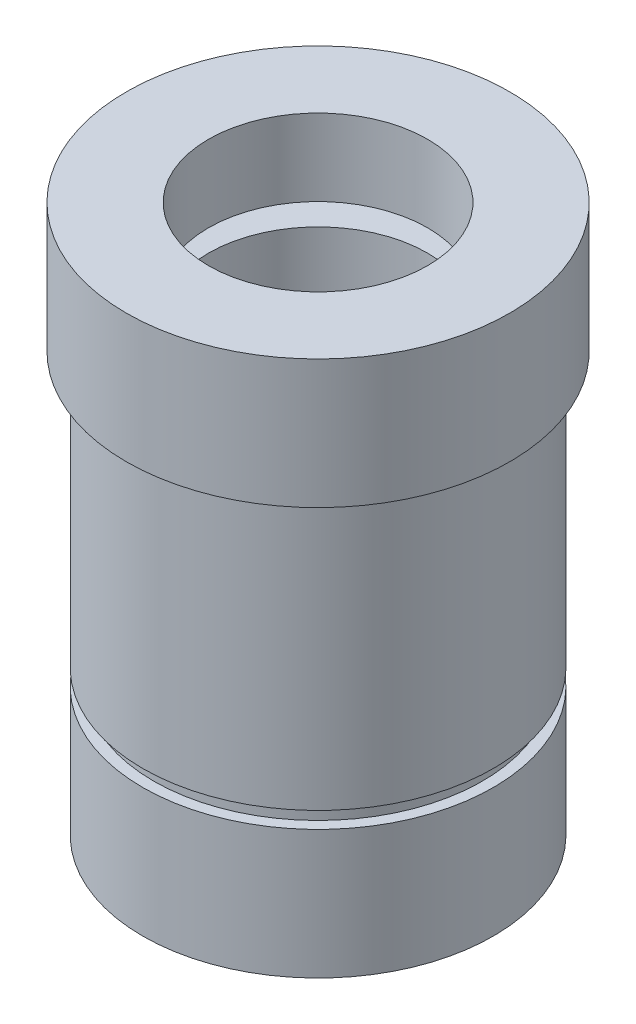
ISO-10303-21;
HEADER;
FILE_DESCRIPTION(('STEP AP214'),'2;1');
FILE_NAME('part.step','',(''),(''),'','','');
FILE_SCHEMA(('AUTOMOTIVE_DESIGN { 1 0 10303 214 1 1 1 1 }'));
ENDSEC;
DATA;
#1=APPLICATION_CONTEXT('core data for automotive mechanical design processes');
#2=APPLICATION_PROTOCOL_DEFINITION('international standard','automotive_design',2000,#1);
#3=PRODUCT_CONTEXT('',#1,'mechanical');
#4=PRODUCT('Part','Part','',(#3));
#5=PRODUCT_RELATED_PRODUCT_CATEGORY('part','',(#4));
#6=PRODUCT_DEFINITION_FORMATION('','',#4);
#7=PRODUCT_DEFINITION_CONTEXT('part definition',#1,'design');
#8=PRODUCT_DEFINITION('design','',#6,#7);
#9=PRODUCT_DEFINITION_SHAPE('','',#8);
#10=(LENGTH_UNIT() NAMED_UNIT(*) SI_UNIT(.MILLI.,.METRE.));
#11=(NAMED_UNIT(*) PLANE_ANGLE_UNIT() SI_UNIT($,.RADIAN.));
#12=(NAMED_UNIT(*) SI_UNIT($,.STERADIAN.) SOLID_ANGLE_UNIT());
#13=UNCERTAINTY_MEASURE_WITH_UNIT(LENGTH_MEASURE(1.E-05),#10,'distance_accuracy_value','');
#14=(GEOMETRIC_REPRESENTATION_CONTEXT(3) GLOBAL_UNCERTAINTY_ASSIGNED_CONTEXT((#13)) GLOBAL_UNIT_ASSIGNED_CONTEXT((#10,
#11,#12)) REPRESENTATION_CONTEXT('',''));
#15=CARTESIAN_POINT('',(0.,0.,0.));
#16=DIRECTION('',(0.,0.,1.));
#17=DIRECTION('',(1.,0.,0.));
#18=AXIS2_PLACEMENT_3D('',#15,#16,#17);
#19=CARTESIAN_POINT('',(0.,-26.8678822354766,0.));
#20=DIRECTION('',(0.,1.,0.));
#21=DIRECTION('',(0.,0.,1.));
#22=AXIS2_PLACEMENT_3D('',#19,#20,#21);
#23=CYLINDRICAL_SURFACE('',#22,10.);
#24=CARTESIAN_POINT('',(0.,14.1321177645234,0.));
#25=DIRECTION('',(0.,1.,0.));
#26=DIRECTION('',(0.,0.,1.));
#27=AXIS2_PLACEMENT_3D('',#24,#25,#26);
#28=CIRCLE('',#27,10.);
#29=CARTESIAN_POINT('',(0.,14.1321177645234,10.));
#30=VERTEX_POINT('',#29);
#31=EDGE_CURVE('E60',#30,#30,#28,.F.);
#32=CARTESIAN_POINT('',(0.,-17.8678822354766,0.));
#33=DIRECTION('',(0.,-1.,0.));
#34=DIRECTION('',(0.,0.,-1.));
#35=AXIS2_PLACEMENT_3D('',#32,#33,#34);
#36=CIRCLE('',#35,10.);
#37=CARTESIAN_POINT('',(0.,-17.8678822354766,10.));
#38=VERTEX_POINT('',#37);
#39=EDGE_CURVE('E41',#38,#38,#36,.F.);
#40=CARTESIAN_POINT('',(0.,14.1321177645234,10.));
#41=CARTESIAN_POINT('',(0.,13.7987844311901,10.));
#42=CARTESIAN_POINT('',(0.,13.4654510978568,10.));
#43=CARTESIAN_POINT('',(0.,12.7987844311901,10.));
#44=CARTESIAN_POINT('',(0.,12.4654510978568,10.));
#45=CARTESIAN_POINT('',(0.,11.7987844311901,10.));
#46=CARTESIAN_POINT('',(0.,11.4654510978568,10.));
#47=CARTESIAN_POINT('',(0.,10.7987844311901,10.));
#48=CARTESIAN_POINT('',(0.,10.4654510978568,10.));
#49=CARTESIAN_POINT('',(0.,9.7987844311901,10.));
#50=CARTESIAN_POINT('',(0.,9.46545109785677,10.));
#51=CARTESIAN_POINT('',(0.,8.7987844311901,10.));
#52=CARTESIAN_POINT('',(0.,8.46545109785676,10.));
#53=CARTESIAN_POINT('',(0.,7.7987844311901,10.));
#54=CARTESIAN_POINT('',(0.,7.46545109785677,10.));
#55=CARTESIAN_POINT('',(0.,6.7987844311901,10.));
#56=CARTESIAN_POINT('',(0.,6.46545109785677,10.));
#57=CARTESIAN_POINT('',(0.,5.7987844311901,10.));
#58=CARTESIAN_POINT('',(0.,5.46545109785677,10.));
#59=CARTESIAN_POINT('',(0.,4.7987844311901,10.));
#60=CARTESIAN_POINT('',(0.,4.46545109785677,10.));
#61=CARTESIAN_POINT('',(0.,3.79878443119011,10.));
#62=CARTESIAN_POINT('',(0.,3.46545109785677,10.));
#63=CARTESIAN_POINT('',(0.,2.7987844311901,10.));
#64=CARTESIAN_POINT('',(0.,2.46545109785677,10.));
#65=CARTESIAN_POINT('',(0.,1.7987844311901,10.));
#66=CARTESIAN_POINT('',(0.,1.46545109785677,10.));
#67=CARTESIAN_POINT('',(0.,0.798784431190106,10.));
#68=CARTESIAN_POINT('',(0.,0.465451097856772,10.));
#69=CARTESIAN_POINT('',(0.,-0.201215568809894,10.));
#70=CARTESIAN_POINT('',(0.,-0.534548902143226,10.));
#71=CARTESIAN_POINT('',(0.,-1.20121556880989,10.));
#72=CARTESIAN_POINT('',(0.,-1.53454890214323,10.));
#73=CARTESIAN_POINT('',(0.,-2.20121556880989,10.));
#74=CARTESIAN_POINT('',(0.,-2.53454890214323,10.));
#75=CARTESIAN_POINT('',(0.,-3.20121556880989,10.));
#76=CARTESIAN_POINT('',(0.,-3.53454890214323,10.));
#77=CARTESIAN_POINT('',(0.,-4.20121556880989,10.));
#78=CARTESIAN_POINT('',(0.,-4.53454890214323,10.));
#79=CARTESIAN_POINT('',(0.,-5.20121556880989,10.));
#80=CARTESIAN_POINT('',(0.,-5.53454890214322,10.));
#81=CARTESIAN_POINT('',(0.,-6.20121556880989,10.));
#82=CARTESIAN_POINT('',(0.,-6.53454890214322,10.));
#83=CARTESIAN_POINT('',(0.,-7.20121556880989,10.));
#84=CARTESIAN_POINT('',(0.,-7.53454890214322,10.));
#85=CARTESIAN_POINT('',(0.,-8.20121556880989,10.));
#86=CARTESIAN_POINT('',(0.,-8.53454890214322,10.));
#87=CARTESIAN_POINT('',(0.,-9.20121556880989,10.));
#88=CARTESIAN_POINT('',(0.,-9.53454890214322,10.));
#89=CARTESIAN_POINT('',(0.,-10.2012155688099,10.));
#90=CARTESIAN_POINT('',(0.,-10.5345489021432,10.));
#91=CARTESIAN_POINT('',(0.,-11.2012155688099,10.));
#92=CARTESIAN_POINT('',(0.,-11.5345489021432,10.));
#93=CARTESIAN_POINT('',(0.,-12.2012155688099,10.));
#94=CARTESIAN_POINT('',(0.,-12.5345489021432,10.));
#95=CARTESIAN_POINT('',(0.,-13.2012155688099,10.));
#96=CARTESIAN_POINT('',(0.,-13.5345489021432,10.));
#97=CARTESIAN_POINT('',(0.,-14.2012155688099,10.));
#98=CARTESIAN_POINT('',(0.,-14.5345489021432,10.));
#99=CARTESIAN_POINT('',(0.,-15.2012155688099,10.));
#100=CARTESIAN_POINT('',(0.,-15.5345489021432,10.));
#101=CARTESIAN_POINT('',(0.,-16.2012155688099,10.));
#102=CARTESIAN_POINT('',(0.,-16.5345489021432,10.));
#103=CARTESIAN_POINT('',(0.,-17.2012155688099,10.));
#104=CARTESIAN_POINT('',(0.,-17.5345489021432,10.));
#105=CARTESIAN_POINT('',(0.,-17.8678822354766,10.));
#106=B_SPLINE_CURVE_WITH_KNOTS('',3,(#40,#41,#42,#43,#44,#45,#46,#47,#48,#49,#50,#51,#52,#53,
#54,#55,#56,#57,#58,#59,#60,#61,#62,#63,#64,#65,#66,#67,#68,#69,#70,#71,#72,#73,#74,#75,#76,#77,
#78,#79,#80,#81,#82,#83,#84,#85,#86,#87,#88,#89,#90,#91,#92,#93,#94,#95,#96,#97,#98,#99,#100,
#101,#102,#103,#104,#105),.UNSPECIFIED.,.F.,.F.,(4,2,2,2,2,2,2,2,2,2,2,2,2,2,2,2,2,2,2,2,2,2,2,
2,2,2,2,2,2,2,2,2,4),(0.,1.,2.,3.,4.,5.,6.,7.,7.99999999999999,8.99999999999999,
9.99999999999999,11.,12.,13.,14.,15.,16.,17.,18.,19.,20.,21.,22.,23.,24.,25.,26.,27.,28.,29.,
30.,31.,32.),.UNSPECIFIED.);
#107=EDGE_CURVE('BSEAM37',#30,#38,#106,.T.);
#108=ORIENTED_EDGE('',*,*,#31,.F.);
#109=ORIENTED_EDGE('',*,*,#39,.F.);
#110=ORIENTED_EDGE('',*,*,#107,.T.);
#111=ORIENTED_EDGE('',*,*,#107,.F.);
#112=EDGE_LOOP('',(#108,#110,#109,#111));
#113=FACE_BOUND('',#112,.T.);
#114=ADVANCED_FACE('F37',(#113),#23,.F.);
#115=CARTESIAN_POINT('',(0.,-19.8678822354766,0.));
#116=DIRECTION('',(0.,-1.,0.));
#117=DIRECTION('',(0.,0.,-1.));
#118=AXIS2_PLACEMENT_3D('',#115,#116,#117);
#119=CIRCLE('',#118,10.);
#120=CARTESIAN_POINT('',(0.,-19.8678822354766,10.));
#121=VERTEX_POINT('',#120);
#122=EDGE_CURVE('E65',#121,#121,#119,.F.);
#123=CARTESIAN_POINT('',(0.,-26.8678822354766,0.));
#124=DIRECTION('',(0.,1.,0.));
#125=DIRECTION('',(0.,0.,1.));
#126=AXIS2_PLACEMENT_3D('',#123,#124,#125);
#127=CIRCLE('',#126,10.);
#128=CARTESIAN_POINT('',(0.,-26.8678822354766,10.));
#129=VERTEX_POINT('',#128);
#130=EDGE_CURVE('E90',#129,#129,#127,.T.);
#131=CARTESIAN_POINT('',(0.,-19.8678822354766,10.));
#132=CARTESIAN_POINT('',(0.,-19.9407989021432,10.));
#133=CARTESIAN_POINT('',(0.,-20.0137155688099,10.));
#134=CARTESIAN_POINT('',(0.,-20.1595489021432,10.));
#135=CARTESIAN_POINT('',(0.,-20.2324655688099,10.));
#136=CARTESIAN_POINT('',(0.,-20.3782989021432,10.));
#137=CARTESIAN_POINT('',(0.,-20.4512155688099,10.));
#138=CARTESIAN_POINT('',(0.,-20.5970489021432,10.));
#139=CARTESIAN_POINT('',(0.,-20.6699655688099,10.));
#140=CARTESIAN_POINT('',(0.,-20.8157989021432,10.));
#141=CARTESIAN_POINT('',(0.,-20.8887155688099,10.));
#142=CARTESIAN_POINT('',(0.,-21.0345489021432,10.));
#143=CARTESIAN_POINT('',(0.,-21.1074655688099,10.));
#144=CARTESIAN_POINT('',(0.,-21.2532989021432,10.));
#145=CARTESIAN_POINT('',(0.,-21.3262155688099,10.));
#146=CARTESIAN_POINT('',(0.,-21.4720489021432,10.));
#147=CARTESIAN_POINT('',(0.,-21.5449655688099,10.));
#148=CARTESIAN_POINT('',(0.,-21.6907989021432,10.));
#149=CARTESIAN_POINT('',(0.,-21.7637155688099,10.));
#150=CARTESIAN_POINT('',(0.,-21.9095489021432,10.));
#151=CARTESIAN_POINT('',(0.,-21.9824655688099,10.));
#152=CARTESIAN_POINT('',(0.,-22.1282989021432,10.));
#153=CARTESIAN_POINT('',(0.,-22.2012155688099,10.));
#154=CARTESIAN_POINT('',(0.,-22.3470489021432,10.));
#155=CARTESIAN_POINT('',(0.,-22.4199655688099,10.));
#156=CARTESIAN_POINT('',(0.,-22.5657989021432,10.));
#157=CARTESIAN_POINT('',(0.,-22.6387155688099,10.));
#158=CARTESIAN_POINT('',(0.,-22.7845489021432,10.));
#159=CARTESIAN_POINT('',(0.,-22.8574655688099,10.));
#160=CARTESIAN_POINT('',(0.,-23.0032989021432,10.));
#161=CARTESIAN_POINT('',(0.,-23.0762155688099,10.));
#162=CARTESIAN_POINT('',(0.,-23.2220489021432,10.));
#163=CARTESIAN_POINT('',(0.,-23.2949655688099,10.));
#164=CARTESIAN_POINT('',(0.,-23.4407989021432,10.));
#165=CARTESIAN_POINT('',(0.,-23.5137155688099,10.));
#166=CARTESIAN_POINT('',(0.,-23.6595489021432,10.));
#167=CARTESIAN_POINT('',(0.,-23.7324655688099,10.));
#168=CARTESIAN_POINT('',(0.,-23.8782989021432,10.));
#169=CARTESIAN_POINT('',(0.,-23.9512155688099,10.));
#170=CARTESIAN_POINT('',(0.,-24.0970489021432,10.));
#171=CARTESIAN_POINT('',(0.,-24.1699655688099,10.));
#172=CARTESIAN_POINT('',(0.,-24.3157989021432,10.));
#173=CARTESIAN_POINT('',(0.,-24.3887155688099,10.));
#174=CARTESIAN_POINT('',(0.,-24.5345489021432,10.));
#175=CARTESIAN_POINT('',(0.,-24.6074655688099,10.));
#176=CARTESIAN_POINT('',(0.,-24.7532989021432,10.));
#177=CARTESIAN_POINT('',(0.,-24.8262155688099,10.));
#178=CARTESIAN_POINT('',(0.,-24.9720489021432,10.));
#179=CARTESIAN_POINT('',(0.,-25.0449655688099,10.));
#180=CARTESIAN_POINT('',(0.,-25.1907989021432,10.));
#181=CARTESIAN_POINT('',(0.,-25.2637155688099,10.));
#182=CARTESIAN_POINT('',(0.,-25.4095489021432,10.));
#183=CARTESIAN_POINT('',(0.,-25.4824655688099,10.));
#184=CARTESIAN_POINT('',(0.,-25.6282989021432,10.));
#185=CARTESIAN_POINT('',(0.,-25.7012155688099,10.));
#186=CARTESIAN_POINT('',(0.,-25.8470489021432,10.));
#187=CARTESIAN_POINT('',(0.,-25.9199655688099,10.));
#188=CARTESIAN_POINT('',(0.,-26.0657989021432,10.));
#189=CARTESIAN_POINT('',(0.,-26.1387155688099,10.));
#190=CARTESIAN_POINT('',(0.,-26.2845489021432,10.));
#191=CARTESIAN_POINT('',(0.,-26.3574655688099,10.));
#192=CARTESIAN_POINT('',(0.,-26.5032989021432,10.));
#193=CARTESIAN_POINT('',(0.,-26.5762155688099,10.));
#194=CARTESIAN_POINT('',(0.,-26.7220489021432,10.));
#195=CARTESIAN_POINT('',(0.,-26.7949655688099,10.));
#196=CARTESIAN_POINT('',(0.,-26.8678822354766,10.));
#197=B_SPLINE_CURVE_WITH_KNOTS('',3,(#131,#132,#133,#134,#135,#136,#137,#138,#139,#140,#141,
#142,#143,#144,#145,#146,#147,#148,#149,#150,#151,#152,#153,#154,#155,#156,#157,#158,#159,#160,
#161,#162,#163,#164,#165,#166,#167,#168,#169,#170,#171,#172,#173,#174,#175,#176,#177,#178,#179,
#180,#181,#182,#183,#184,#185,#186,#187,#188,#189,#190,#191,#192,#193,#194,#195,#196),
.UNSPECIFIED.,.F.,.F.,(4,2,2,2,2,2,2,2,2,2,2,2,2,2,2,2,2,2,2,2,2,2,2,2,2,2,2,2,2,2,2,2,4),(0.,
0.21875,0.4375,0.656250000000001,0.875000000000001,1.09375,1.3125,1.53125,1.75,1.96875,2.1875,
2.40625,2.625,2.84375,3.0625,3.28125,3.5,3.71875,3.9375,4.15625,4.375,4.59375,4.8125,5.03125,
5.25,5.46875,5.68750000000001,5.90625000000001,6.12500000000001,6.34375000000001,
6.56250000000001,6.78125000000001,7.),.UNSPECIFIED.);
#198=EDGE_CURVE('BSEAM163',#121,#129,#197,.T.);
#199=ORIENTED_EDGE('',*,*,#122,.T.);
#200=ORIENTED_EDGE('',*,*,#130,.F.);
#201=ORIENTED_EDGE('',*,*,#198,.T.);
#202=ORIENTED_EDGE('',*,*,#198,.F.);
#203=EDGE_LOOP('',(#199,#201,#200,#202));
#204=FACE_BOUND('',#203,.T.);
#205=ADVANCED_FACE('F163',(#204),#23,.F.);
#206=CARTESIAN_POINT('',(0.,23.1321177645234,0.));
#207=DIRECTION('',(0.,-1.,0.));
#208=DIRECTION('',(0.,0.,-1.));
#209=AXIS2_PLACEMENT_3D('',#206,#207,#208);
#210=PLANE('',#209);
#211=CARTESIAN_POINT('',(0.,23.1321177645234,0.));
#212=DIRECTION('',(0.,1.,0.));
#213=DIRECTION('',(0.,0.,1.));
#214=AXIS2_PLACEMENT_3D('',#211,#212,#213);
#215=CIRCLE('',#214,10.);
#216=CARTESIAN_POINT('',(0.,23.1321177645234,10.));
#217=VERTEX_POINT('',#216);
#218=EDGE_CURVE('E64',#217,#217,#215,.T.);
#219=ORIENTED_EDGE('',*,*,#218,.F.);
#220=EDGE_LOOP('',(#219));
#221=FACE_BOUND('',#220,.T.);
#222=CARTESIAN_POINT('',(0.,23.1321177645234,0.));
#223=DIRECTION('',(0.,1.,0.));
#224=DIRECTION('',(0.,0.,1.));
#225=AXIS2_PLACEMENT_3D('',#222,#223,#224);
#226=CIRCLE('',#225,17.5);
#227=CARTESIAN_POINT('',(0.,23.1321177645234,17.5));
#228=VERTEX_POINT('',#227);
#229=EDGE_CURVE('E10',#228,#228,#226,.T.);
#230=ORIENTED_EDGE('',*,*,#229,.T.);
#231=EDGE_LOOP('',(#230));
#232=FACE_BOUND('',#231,.T.);
#233=ADVANCED_FACE('F39',(#221,#232),#210,.F.);
#234=CARTESIAN_POINT('',(0.,23.3627204030227,0.));
#235=DIRECTION('',(0.,1.,0.));
#236=DIRECTION('',(0.,0.,1.));
#237=AXIS2_PLACEMENT_3D('',#234,#235,#236);
#238=CYLINDRICAL_SURFACE('',#237,17.5);
#239=ORIENTED_EDGE('',*,*,#229,.F.);
#240=EDGE_LOOP('',(#239));
#241=FACE_BOUND('',#240,.T.);
#242=CARTESIAN_POINT('',(0.,11.3821177645234,0.));
#243=DIRECTION('',(0.,1.,0.));
#244=DIRECTION('',(0.,0.,1.));
#245=AXIS2_PLACEMENT_3D('',#242,#243,#244);
#246=CIRCLE('',#245,17.5);
#247=CARTESIAN_POINT('',(0.,11.3821177645234,17.5));
#248=VERTEX_POINT('',#247);
#249=EDGE_CURVE('E46',#248,#248,#246,.T.);
#250=ORIENTED_EDGE('',*,*,#249,.T.);
#251=EDGE_LOOP('',(#250));
#252=FACE_BOUND('',#251,.T.);
#253=ADVANCED_FACE('F279',(#241,#252),#238,.T.);
#254=CARTESIAN_POINT('',(17.5,11.3821177645234,0.));
#255=DIRECTION('',(0.,1.,0.));
#256=DIRECTION('',(0.,0.,1.));
#257=AXIS2_PLACEMENT_3D('',#254,#255,#256);
#258=PLANE('',#257);
#259=ORIENTED_EDGE('',*,*,#249,.F.);
#260=EDGE_LOOP('',(#259));
#261=FACE_BOUND('',#260,.T.);
#262=CARTESIAN_POINT('',(0.,11.3821177645234,0.));
#263=DIRECTION('',(0.,1.,0.));
#264=DIRECTION('',(0.,0.,1.));
#265=AXIS2_PLACEMENT_3D('',#262,#263,#264);
#266=CIRCLE('',#265,16.);
#267=CARTESIAN_POINT('',(0.,11.3821177645234,16.));
#268=VERTEX_POINT('',#267);
#269=EDGE_CURVE('E52',#268,#268,#266,.T.);
#270=ORIENTED_EDGE('',*,*,#269,.T.);
#271=EDGE_LOOP('',(#270));
#272=FACE_BOUND('',#271,.T.);
#273=ADVANCED_FACE('F120',(#261,#272),#258,.F.);
#274=CARTESIAN_POINT('',(0.,23.3627204030227,0.));
#275=DIRECTION('',(0.,1.,0.));
#276=DIRECTION('',(0.,0.,1.));
#277=AXIS2_PLACEMENT_3D('',#274,#275,#276);
#278=CYLINDRICAL_SURFACE('',#277,16.);
#279=ORIENTED_EDGE('',*,*,#269,.F.);
#280=EDGE_LOOP('',(#279));
#281=FACE_BOUND('',#280,.T.);
#282=CARTESIAN_POINT('',(0.,-13.6178822354766,0.));
#283=DIRECTION('',(0.,1.,0.));
#284=DIRECTION('',(0.,0.,1.));
#285=AXIS2_PLACEMENT_3D('',#282,#283,#284);
#286=CIRCLE('',#285,16.);
#287=CARTESIAN_POINT('',(0.,-13.6178822354766,16.));
#288=VERTEX_POINT('',#287);
#289=EDGE_CURVE('E113',#288,#288,#286,.T.);
#290=ORIENTED_EDGE('',*,*,#289,.T.);
#291=EDGE_LOOP('',(#290));
#292=FACE_BOUND('',#291,.T.);
#293=ADVANCED_FACE('F122',(#281,#292),#278,.T.);
#294=CARTESIAN_POINT('',(16.,-13.6178822354766,0.));
#295=DIRECTION('',(0.,1.,0.));
#296=DIRECTION('',(0.,0.,1.));
#297=AXIS2_PLACEMENT_3D('',#294,#295,#296);
#298=PLANE('',#297);
#299=ORIENTED_EDGE('',*,*,#289,.F.);
#300=EDGE_LOOP('',(#299));
#301=FACE_BOUND('',#300,.T.);
#302=CARTESIAN_POINT('',(0.,-13.6178822354766,0.));
#303=DIRECTION('',(0.,1.,0.));
#304=DIRECTION('',(0.,0.,1.));
#305=AXIS2_PLACEMENT_3D('',#302,#303,#304);
#306=CIRCLE('',#305,15.);
#307=CARTESIAN_POINT('',(0.,-13.6178822354766,15.));
#308=VERTEX_POINT('',#307);
#309=EDGE_CURVE('E109',#308,#308,#306,.T.);
#310=ORIENTED_EDGE('',*,*,#309,.T.);
#311=EDGE_LOOP('',(#310));
#312=FACE_BOUND('',#311,.T.);
#313=ADVANCED_FACE('F125',(#301,#312),#298,.F.);
#314=CARTESIAN_POINT('',(0.,23.3627204030227,0.));
#315=DIRECTION('',(0.,1.,0.));
#316=DIRECTION('',(0.,0.,1.));
#317=AXIS2_PLACEMENT_3D('',#314,#315,#316);
#318=CYLINDRICAL_SURFACE('',#317,15.);
#319=ORIENTED_EDGE('',*,*,#309,.F.);
#320=EDGE_LOOP('',(#319));
#321=FACE_BOUND('',#320,.T.);
#322=CARTESIAN_POINT('',(0.,-15.1178822354766,0.));
#323=DIRECTION('',(0.,1.,0.));
#324=DIRECTION('',(0.,0.,1.));
#325=AXIS2_PLACEMENT_3D('',#322,#323,#324);
#326=CIRCLE('',#325,15.);
#327=CARTESIAN_POINT('',(0.,-15.1178822354766,15.));
#328=VERTEX_POINT('',#327);
#329=EDGE_CURVE('E105',#328,#328,#326,.T.);
#330=ORIENTED_EDGE('',*,*,#329,.T.);
#331=EDGE_LOOP('',(#330));
#332=FACE_BOUND('',#331,.T.);
#333=ADVANCED_FACE('F131',(#321,#332),#318,.T.);
#334=CARTESIAN_POINT('',(15.,-15.1178822354766,0.));
#335=DIRECTION('',(0.,-1.,0.));
#336=DIRECTION('',(0.,0.,-1.));
#337=AXIS2_PLACEMENT_3D('',#334,#335,#336);
#338=PLANE('',#337);
#339=ORIENTED_EDGE('',*,*,#329,.F.);
#340=EDGE_LOOP('',(#339));
#341=FACE_BOUND('',#340,.T.);
#342=CARTESIAN_POINT('',(0.,-15.1178822354766,0.));
#343=DIRECTION('',(0.,1.,0.));
#344=DIRECTION('',(0.,0.,1.));
#345=AXIS2_PLACEMENT_3D('',#342,#343,#344);
#346=CIRCLE('',#345,16.);
#347=CARTESIAN_POINT('',(0.,-15.1178822354766,16.));
#348=VERTEX_POINT('',#347);
#349=EDGE_CURVE('E101',#348,#348,#346,.T.);
#350=ORIENTED_EDGE('',*,*,#349,.T.);
#351=EDGE_LOOP('',(#350));
#352=FACE_BOUND('',#351,.T.);
#353=ADVANCED_FACE('F137',(#341,#352),#338,.F.);
#354=CARTESIAN_POINT('',(0.,23.3627204030227,0.));
#355=DIRECTION('',(0.,1.,0.));
#356=DIRECTION('',(0.,0.,1.));
#357=AXIS2_PLACEMENT_3D('',#354,#355,#356);
#358=CYLINDRICAL_SURFACE('',#357,16.);
#359=ORIENTED_EDGE('',*,*,#349,.F.);
#360=EDGE_LOOP('',(#359));
#361=FACE_BOUND('',#360,.T.);
#362=CARTESIAN_POINT('',(0.,-26.8678822354766,0.));
#363=DIRECTION('',(0.,1.,0.));
#364=DIRECTION('',(0.,0.,1.));
#365=AXIS2_PLACEMENT_3D('',#362,#363,#364);
#366=CIRCLE('',#365,16.);
#367=CARTESIAN_POINT('',(0.,-26.8678822354766,16.));
#368=VERTEX_POINT('',#367);
#369=EDGE_CURVE('E94',#368,#368,#366,.T.);
#370=ORIENTED_EDGE('',*,*,#369,.T.);
#371=EDGE_LOOP('',(#370));
#372=FACE_BOUND('',#371,.T.);
#373=ADVANCED_FACE('F143',(#361,#372),#358,.T.);
#374=CARTESIAN_POINT('',(16.,-26.8678822354766,0.));
#375=DIRECTION('',(0.,1.,0.));
#376=DIRECTION('',(0.,0.,1.));
#377=AXIS2_PLACEMENT_3D('',#374,#375,#376);
#378=PLANE('',#377);
#379=ORIENTED_EDGE('',*,*,#130,.T.);
#380=EDGE_LOOP('',(#379));
#381=FACE_BOUND('',#380,.T.);
#382=ORIENTED_EDGE('',*,*,#369,.F.);
#383=EDGE_LOOP('',(#382));
#384=FACE_BOUND('',#383,.T.);
#385=ADVANCED_FACE('F149',(#381,#384),#378,.F.);
#386=CARTESIAN_POINT('',(0.,16.1321177645234,0.));
#387=DIRECTION('',(0.,1.,0.));
#388=DIRECTION('',(0.,0.,1.));
#389=AXIS2_PLACEMENT_3D('',#386,#387,#388);
#390=CIRCLE('',#389,10.);
#391=CARTESIAN_POINT('',(0.,16.1321177645234,10.));
#392=VERTEX_POINT('',#391);
#393=EDGE_CURVE('E56',#392,#392,#390,.F.);
#394=CARTESIAN_POINT('',(0.,16.1321177645234,10.));
#395=CARTESIAN_POINT('',(0.,16.2050344311901,10.));
#396=CARTESIAN_POINT('',(0.,16.2779510978568,10.));
#397=CARTESIAN_POINT('',(0.,16.4237844311901,10.));
#398=CARTESIAN_POINT('',(0.,16.4967010978568,10.));
#399=CARTESIAN_POINT('',(0.,16.6425344311901,10.));
#400=CARTESIAN_POINT('',(0.,16.7154510978568,10.));
#401=CARTESIAN_POINT('',(0.,16.8612844311901,10.));
#402=CARTESIAN_POINT('',(0.,16.9342010978568,10.));
#403=CARTESIAN_POINT('',(0.,17.0800344311901,10.));
#404=CARTESIAN_POINT('',(0.,17.1529510978568,10.));
#405=CARTESIAN_POINT('',(0.,17.2987844311901,10.));
#406=CARTESIAN_POINT('',(0.,17.3717010978568,10.));
#407=CARTESIAN_POINT('',(0.,17.5175344311901,10.));
#408=CARTESIAN_POINT('',(0.,17.5904510978568,10.));
#409=CARTESIAN_POINT('',(0.,17.7362844311901,10.));
#410=CARTESIAN_POINT('',(0.,17.8092010978568,10.));
#411=CARTESIAN_POINT('',(0.,17.9550344311901,10.));
#412=CARTESIAN_POINT('',(0.,18.0279510978568,10.));
#413=CARTESIAN_POINT('',(0.,18.1737844311901,10.));
#414=CARTESIAN_POINT('',(0.,18.2467010978568,10.));
#415=CARTESIAN_POINT('',(0.,18.3925344311901,10.));
#416=CARTESIAN_POINT('',(0.,18.4654510978568,10.));
#417=CARTESIAN_POINT('',(0.,18.6112844311901,10.));
#418=CARTESIAN_POINT('',(0.,18.6842010978568,10.));
#419=CARTESIAN_POINT('',(0.,18.8300344311901,10.));
#420=CARTESIAN_POINT('',(0.,18.9029510978568,10.));
#421=CARTESIAN_POINT('',(0.,19.0487844311901,10.));
#422=CARTESIAN_POINT('',(0.,19.1217010978568,10.));
#423=CARTESIAN_POINT('',(0.,19.2675344311901,10.));
#424=CARTESIAN_POINT('',(0.,19.3404510978568,10.));
#425=CARTESIAN_POINT('',(0.,19.4862844311901,10.));
#426=CARTESIAN_POINT('',(0.,19.5592010978568,10.));
#427=CARTESIAN_POINT('',(0.,19.7050344311901,10.));
#428=CARTESIAN_POINT('',(0.,19.7779510978568,10.));
#429=CARTESIAN_POINT('',(0.,19.9237844311901,10.));
#430=CARTESIAN_POINT('',(0.,19.9967010978568,10.));
#431=CARTESIAN_POINT('',(0.,20.1425344311901,10.));
#432=CARTESIAN_POINT('',(0.,20.2154510978568,10.));
#433=CARTESIAN_POINT('',(0.,20.3612844311901,10.));
#434=CARTESIAN_POINT('',(0.,20.4342010978568,10.));
#435=CARTESIAN_POINT('',(0.,20.5800344311901,10.));
#436=CARTESIAN_POINT('',(0.,20.6529510978568,10.));
#437=CARTESIAN_POINT('',(0.,20.7987844311901,10.));
#438=CARTESIAN_POINT('',(0.,20.8717010978568,10.));
#439=CARTESIAN_POINT('',(0.,21.0175344311901,10.));
#440=CARTESIAN_POINT('',(0.,21.0904510978568,10.));
#441=CARTESIAN_POINT('',(0.,21.2362844311901,10.));
#442=CARTESIAN_POINT('',(0.,21.3092010978568,10.));
#443=CARTESIAN_POINT('',(0.,21.4550344311901,10.));
#444=CARTESIAN_POINT('',(0.,21.5279510978568,10.));
#445=CARTESIAN_POINT('',(0.,21.6737844311901,10.));
#446=CARTESIAN_POINT('',(0.,21.7467010978568,10.));
#447=CARTESIAN_POINT('',(0.,21.8925344311901,10.));
#448=CARTESIAN_POINT('',(0.,21.9654510978568,10.));
#449=CARTESIAN_POINT('',(0.,22.1112844311901,10.));
#450=CARTESIAN_POINT('',(0.,22.1842010978568,10.));
#451=CARTESIAN_POINT('',(0.,22.3300344311901,10.));
#452=CARTESIAN_POINT('',(0.,22.4029510978568,10.));
#453=CARTESIAN_POINT('',(0.,22.5487844311901,10.));
#454=CARTESIAN_POINT('',(0.,22.6217010978568,10.));
#455=CARTESIAN_POINT('',(0.,22.7675344311901,10.));
#456=CARTESIAN_POINT('',(0.,22.8404510978568,10.));
#457=CARTESIAN_POINT('',(0.,22.9862844311901,10.));
#458=CARTESIAN_POINT('',(0.,23.0592010978568,10.));
#459=CARTESIAN_POINT('',(0.,23.1321177645234,10.));
#460=B_SPLINE_CURVE_WITH_KNOTS('',3,(#394,#395,#396,#397,#398,#399,#400,#401,#402,#403,#404,
#405,#406,#407,#408,#409,#410,#411,#412,#413,#414,#415,#416,#417,#418,#419,#420,#421,#422,#423,
#424,#425,#426,#427,#428,#429,#430,#431,#432,#433,#434,#435,#436,#437,#438,#439,#440,#441,#442,
#443,#444,#445,#446,#447,#448,#449,#450,#451,#452,#453,#454,#455,#456,#457,#458,#459),
.UNSPECIFIED.,.F.,.F.,(4,2,2,2,2,2,2,2,2,2,2,2,2,2,2,2,2,2,2,2,2,2,2,2,2,2,2,2,2,2,2,2,4),(0.,
0.218750000000004,0.4375,0.656249999999997,0.875000000000001,1.09375,1.3125,1.53125,1.75,
1.96875000000001,2.1875,2.40625,2.625,2.84375000000001,3.0625,3.28125,3.5,3.71875000000001,
3.9375,4.15625,4.375,4.59375000000001,4.8125,5.03125,5.25,5.46875000000001,5.68750000000001,
5.90625,6.12500000000001,6.34375000000001,6.56250000000001,6.78125,7.00000000000001),.UNSPECIFIED.);
#461=EDGE_CURVE('BSEAM154',#392,#217,#460,.T.);
#462=ORIENTED_EDGE('',*,*,#393,.T.);
#463=ORIENTED_EDGE('',*,*,#218,.T.);
#464=ORIENTED_EDGE('',*,*,#461,.T.);
#465=ORIENTED_EDGE('',*,*,#461,.F.);
#466=EDGE_LOOP('',(#462,#464,#463,#465));
#467=FACE_BOUND('',#466,.T.);
#468=ADVANCED_FACE('F154',(#467),#23,.F.);
#469=CARTESIAN_POINT('',(0.,14.1321177645234,0.));
#470=DIRECTION('',(0.,1.,0.));
#471=DIRECTION('',(0.,0.,1.));
#472=AXIS2_PLACEMENT_3D('',#469,#470,#471);
#473=PLANE('',#472);
#474=CARTESIAN_POINT('',(0.,14.1321177645234,0.));
#475=DIRECTION('',(0.,1.,0.));
#476=DIRECTION('',(0.,0.,1.));
#477=AXIS2_PLACEMENT_3D('',#474,#475,#476);
#478=CIRCLE('',#477,13.);
#479=CARTESIAN_POINT('',(0.,14.1321177645234,13.));
#480=VERTEX_POINT('',#479);
#481=EDGE_CURVE('E61',#480,#480,#478,.T.);
#482=ORIENTED_EDGE('',*,*,#481,.T.);
#483=EDGE_LOOP('',(#482));
#484=FACE_BOUND('',#483,.T.);
#485=ORIENTED_EDGE('',*,*,#31,.T.);
#486=EDGE_LOOP('',(#485));
#487=FACE_BOUND('',#486,.T.);
#488=ADVANCED_FACE('F160',(#484,#487),#473,.T.);
#489=CARTESIAN_POINT('',(0.,16.1321177645234,0.));
#490=DIRECTION('',(0.,1.,0.));
#491=DIRECTION('',(0.,0.,1.));
#492=AXIS2_PLACEMENT_3D('',#489,#490,#491);
#493=PLANE('',#492);
#494=CARTESIAN_POINT('',(0.,16.1321177645234,0.));
#495=DIRECTION('',(0.,1.,0.));
#496=DIRECTION('',(0.,0.,1.));
#497=AXIS2_PLACEMENT_3D('',#494,#495,#496);
#498=CIRCLE('',#497,13.);
#499=CARTESIAN_POINT('',(0.,16.1321177645234,13.));
#500=VERTEX_POINT('',#499);
#501=EDGE_CURVE('E74',#500,#500,#498,.T.);
#502=ORIENTED_EDGE('',*,*,#501,.F.);
#503=EDGE_LOOP('',(#502));
#504=FACE_BOUND('',#503,.T.);
#505=ORIENTED_EDGE('',*,*,#393,.F.);
#506=EDGE_LOOP('',(#505));
#507=FACE_BOUND('',#506,.T.);
#508=ADVANCED_FACE('F176',(#504,#507),#493,.F.);
#509=CARTESIAN_POINT('',(0.,14.1321177645234,0.));
#510=DIRECTION('',(0.,1.,0.));
#511=DIRECTION('',(0.,0.,1.));
#512=AXIS2_PLACEMENT_3D('',#509,#510,#511);
#513=CYLINDRICAL_SURFACE('',#512,13.);
#514=ORIENTED_EDGE('',*,*,#481,.F.);
#515=EDGE_LOOP('',(#514));
#516=FACE_BOUND('',#515,.T.);
#517=ORIENTED_EDGE('',*,*,#501,.T.);
#518=EDGE_LOOP('',(#517));
#519=FACE_BOUND('',#518,.T.);
#520=ADVANCED_FACE('F172',(#516,#519),#513,.F.);
#521=CARTESIAN_POINT('',(0.,-17.8678822354766,0.));
#522=DIRECTION('',(0.,-1.,0.));
#523=DIRECTION('',(0.,0.,-1.));
#524=AXIS2_PLACEMENT_3D('',#521,#522,#523);
#525=PLANE('',#524);
#526=CARTESIAN_POINT('',(0.,-17.8678822354766,0.));
#527=DIRECTION('',(0.,-1.,0.));
#528=DIRECTION('',(0.,0.,-1.));
#529=AXIS2_PLACEMENT_3D('',#526,#527,#528);
#530=CIRCLE('',#529,13.);
#531=CARTESIAN_POINT('',(0.,-17.8678822354766,-13.));
#532=VERTEX_POINT('',#531);
#533=EDGE_CURVE('E68',#532,#532,#530,.T.);
#534=ORIENTED_EDGE('',*,*,#533,.T.);
#535=EDGE_LOOP('',(#534));
#536=FACE_BOUND('',#535,.T.);
#537=ORIENTED_EDGE('',*,*,#39,.T.);
#538=EDGE_LOOP('',(#537));
#539=FACE_BOUND('',#538,.T.);
#540=ADVANCED_FACE('F175',(#536,#539),#525,.T.);
#541=CARTESIAN_POINT('',(0.,-19.8678822354766,0.));
#542=DIRECTION('',(0.,-1.,0.));
#543=DIRECTION('',(0.,0.,-1.));
#544=AXIS2_PLACEMENT_3D('',#541,#542,#543);
#545=PLANE('',#544);
#546=CARTESIAN_POINT('',(0.,-19.8678822354766,0.));
#547=DIRECTION('',(0.,-1.,0.));
#548=DIRECTION('',(0.,0.,-1.));
#549=AXIS2_PLACEMENT_3D('',#546,#547,#548);
#550=CIRCLE('',#549,13.);
#551=CARTESIAN_POINT('',(0.,-19.8678822354766,-13.));
#552=VERTEX_POINT('',#551);
#553=EDGE_CURVE('E76',#552,#552,#550,.T.);
#554=ORIENTED_EDGE('',*,*,#553,.F.);
#555=EDGE_LOOP('',(#554));
#556=FACE_BOUND('',#555,.T.);
#557=ORIENTED_EDGE('',*,*,#122,.F.);
#558=EDGE_LOOP('',(#557));
#559=FACE_BOUND('',#558,.T.);
#560=ADVANCED_FACE('F187',(#556,#559),#545,.F.);
#561=CARTESIAN_POINT('',(0.,-17.8678822354766,0.));
#562=DIRECTION('',(0.,-1.,0.));
#563=DIRECTION('',(0.,0.,-1.));
#564=AXIS2_PLACEMENT_3D('',#561,#562,#563);
#565=CYLINDRICAL_SURFACE('',#564,13.);
#566=ORIENTED_EDGE('',*,*,#533,.F.);
#567=EDGE_LOOP('',(#566));
#568=FACE_BOUND('',#567,.T.);
#569=ORIENTED_EDGE('',*,*,#553,.T.);
#570=EDGE_LOOP('',(#569));
#571=FACE_BOUND('',#570,.T.);
#572=ADVANCED_FACE('F184',(#568,#571),#565,.F.);
#573=CLOSED_SHELL('',(#114,#205,#233,#253,#273,#293,#313,#333,#353,#373,#385,#468,#488,#508,
#520,#540,#560,#572));
#574=MANIFOLD_SOLID_BREP('B2',#573);
#575=ADVANCED_BREP_SHAPE_REPRESENTATION('',(#18,#574),#14);
#576=SHAPE_DEFINITION_REPRESENTATION(#9,#575);
ENDSEC;
END-ISO-10303-21;
